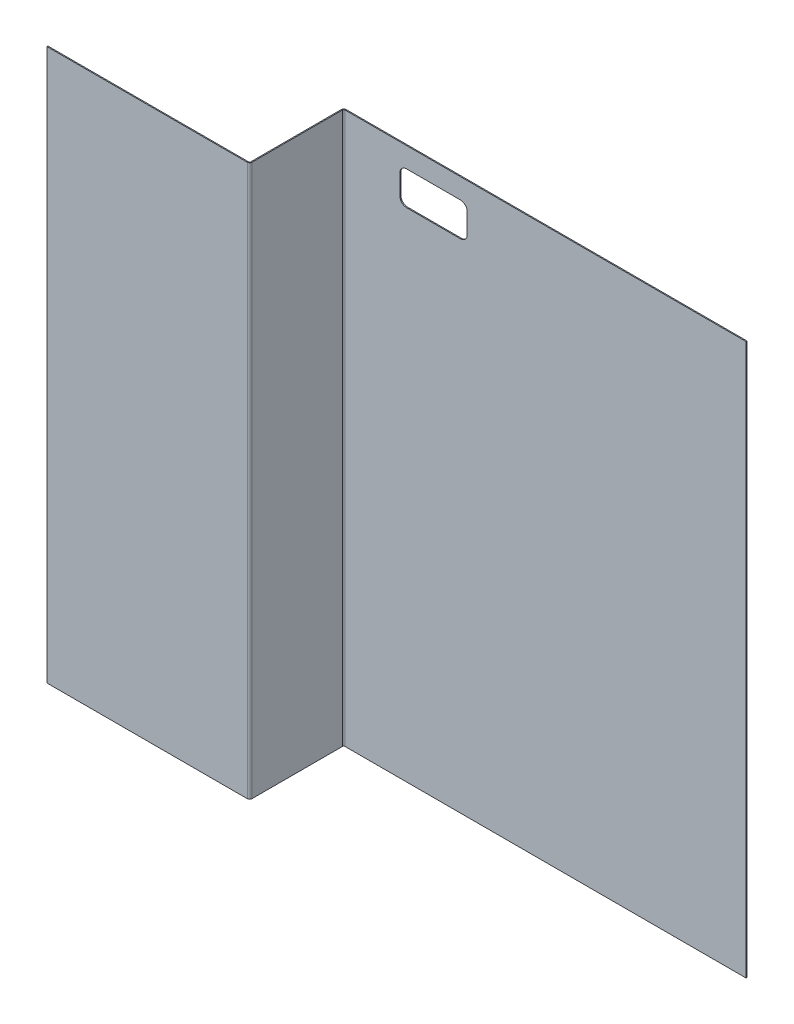
ISO-10303-21;
HEADER;
FILE_DESCRIPTION(('STEP AP214'),'2;1');
FILE_NAME('part.step','',(''),(''),'','','');
FILE_SCHEMA(('AUTOMOTIVE_DESIGN { 1 0 10303 214 1 1 1 1 }'));
ENDSEC;
DATA;
#1=APPLICATION_CONTEXT('core data for automotive mechanical design processes');
#2=APPLICATION_PROTOCOL_DEFINITION('international standard','automotive_design',2000,#1);
#3=PRODUCT_CONTEXT('',#1,'mechanical');
#4=PRODUCT('Part','Part','',(#3));
#5=PRODUCT_RELATED_PRODUCT_CATEGORY('part','',(#4));
#6=PRODUCT_DEFINITION_FORMATION('','',#4);
#7=PRODUCT_DEFINITION_CONTEXT('part definition',#1,'design');
#8=PRODUCT_DEFINITION('design','',#6,#7);
#9=PRODUCT_DEFINITION_SHAPE('','',#8);
#10=(LENGTH_UNIT() NAMED_UNIT(*) SI_UNIT(.MILLI.,.METRE.));
#11=(NAMED_UNIT(*) PLANE_ANGLE_UNIT() SI_UNIT($,.RADIAN.));
#12=(NAMED_UNIT(*) SI_UNIT($,.STERADIAN.) SOLID_ANGLE_UNIT());
#13=UNCERTAINTY_MEASURE_WITH_UNIT(LENGTH_MEASURE(1.E-05),#10,'distance_accuracy_value','');
#14=(GEOMETRIC_REPRESENTATION_CONTEXT(3) GLOBAL_UNCERTAINTY_ASSIGNED_CONTEXT((#13)) GLOBAL_UNIT_ASSIGNED_CONTEXT((#10,
#11,#12)) REPRESENTATION_CONTEXT('',''));
#15=CARTESIAN_POINT('',(0.,0.,0.));
#16=DIRECTION('',(0.,0.,1.));
#17=DIRECTION('',(1.,0.,0.));
#18=AXIS2_PLACEMENT_3D('',#15,#16,#17);
#19=CARTESIAN_POINT('',(301.500000000001,820.,-138.));
#20=DIRECTION('',(0.,1.,0.));
#21=DIRECTION('',(0.,0.,1.));
#22=AXIS2_PLACEMENT_3D('',#19,#20,#21);
#23=PLANE('',#22);
#24=DIRECTION('',(0.,0.,-1.));
#25=VECTOR('',#24,1.);
#26=CARTESIAN_POINT('',(301.500000000001,820.,-138.));
#27=LINE('',#26,#25);
#28=CARTESIAN_POINT('',(301.5,820.,-1.5));
#29=VERTEX_POINT('',#28);
#30=CARTESIAN_POINT('',(301.500000000001,820.,-136.));
#31=VERTEX_POINT('',#30);
#32=EDGE_CURVE('E312',#29,#31,#27,.T.);
#33=ORIENTED_EDGE('',*,*,#32,.T.);
#34=DIRECTION('',(-1.,0.,0.));
#35=VECTOR('',#34,1.);
#36=CARTESIAN_POINT('',(301.500000000001,820.,-136.));
#37=LINE('',#36,#35);
#38=CARTESIAN_POINT('',(300.000000000001,820.,-136.));
#39=VERTEX_POINT('',#38);
#40=EDGE_CURVE('E284',#31,#39,#37,.T.);
#41=ORIENTED_EDGE('',*,*,#40,.T.);
#42=DIRECTION('',(0.,0.,-1.));
#43=VECTOR('',#42,1.);
#44=CARTESIAN_POINT('',(300.000000000001,820.,-138.));
#45=LINE('',#44,#43);
#46=CARTESIAN_POINT('',(300.,820.,-1.50000000000001));
#47=VERTEX_POINT('',#46);
#48=EDGE_CURVE('E311',#47,#39,#45,.T.);
#49=ORIENTED_EDGE('',*,*,#48,.F.);
#50=DIRECTION('',(1.,0.,0.));
#51=VECTOR('',#50,1.);
#52=CARTESIAN_POINT('',(300.,820.,-1.5));
#53=LINE('',#52,#51);
#54=EDGE_CURVE('E298',#47,#29,#53,.T.);
#55=ORIENTED_EDGE('',*,*,#54,.T.);
#56=EDGE_LOOP('',(#33,#41,#49,#55));
#57=FACE_BOUND('',#56,.T.);
#58=ADVANCED_FACE('F40',(#57),#23,.T.);
#59=CARTESIAN_POINT('',(301.5,0.,1.08740406911582E-12));
#60=DIRECTION('',(1.,0.,0.));
#61=DIRECTION('',(0.,0.,-1.));
#62=AXIS2_PLACEMENT_3D('',#59,#60,#61);
#63=PLANE('',#62);
#64=DIRECTION('',(0.,0.,1.));
#65=VECTOR('',#64,1.);
#66=CARTESIAN_POINT('',(301.5,0.,0.500000000000005));
#67=LINE('',#66,#65);
#68=CARTESIAN_POINT('',(301.500000000001,2.18838184637305E-13,-136.));
#69=VERTEX_POINT('',#68);
#70=CARTESIAN_POINT('',(301.5,0.,-1.50000000000002));
#71=VERTEX_POINT('',#70);
#72=EDGE_CURVE('E315',#69,#71,#67,.T.);
#73=ORIENTED_EDGE('',*,*,#72,.F.);
#74=DIRECTION('',(0.,1.,0.));
#75=VECTOR('',#74,1.);
#76=CARTESIAN_POINT('',(301.500000000001,820.,-136.));
#77=LINE('',#76,#75);
#78=EDGE_CURVE('E290',#31,#69,#77,.F.);
#79=ORIENTED_EDGE('',*,*,#78,.F.);
#80=ORIENTED_EDGE('',*,*,#32,.F.);
#81=DIRECTION('',(0.,-1.,0.));
#82=VECTOR('',#81,1.);
#83=CARTESIAN_POINT('',(301.5,0.,-1.50000000000005));
#84=LINE('',#83,#82);
#85=EDGE_CURVE('E306',#29,#71,#84,.T.);
#86=ORIENTED_EDGE('',*,*,#85,.T.);
#87=EDGE_LOOP('',(#73,#79,#80,#86));
#88=FACE_BOUND('',#87,.T.);
#89=ADVANCED_FACE('F414',(#88),#63,.T.);
#90=CARTESIAN_POINT('',(300.,0.,1.08216684710755E-12));
#91=DIRECTION('',(1.,0.,0.));
#92=DIRECTION('',(0.,0.,-1.));
#93=AXIS2_PLACEMENT_3D('',#90,#91,#92);
#94=PLANE('',#93);
#95=DIRECTION('',(0.,1.,0.));
#96=VECTOR('',#95,1.);
#97=CARTESIAN_POINT('',(300.000000000001,820.,-136.));
#98=LINE('',#97,#96);
#99=CARTESIAN_POINT('',(300.000000000001,2.18838184637305E-13,-136.));
#100=VERTEX_POINT('',#99);
#101=EDGE_CURVE('E278',#39,#100,#98,.F.);
#102=ORIENTED_EDGE('',*,*,#101,.T.);
#103=DIRECTION('',(0.,0.,1.));
#104=VECTOR('',#103,1.);
#105=CARTESIAN_POINT('',(300.,0.,0.5));
#106=LINE('',#105,#104);
#107=CARTESIAN_POINT('',(300.,1.11022302462516E-13,-1.50000000000005));
#108=VERTEX_POINT('',#107);
#109=EDGE_CURVE('E316',#100,#108,#106,.T.);
#110=ORIENTED_EDGE('',*,*,#109,.T.);
#111=DIRECTION('',(0.,-1.,0.));
#112=VECTOR('',#111,1.);
#113=CARTESIAN_POINT('',(300.,820.,-1.5));
#114=LINE('',#113,#112);
#115=EDGE_CURVE('E300',#47,#108,#114,.T.);
#116=ORIENTED_EDGE('',*,*,#115,.F.);
#117=ORIENTED_EDGE('',*,*,#48,.T.);
#118=EDGE_LOOP('',(#102,#110,#116,#117));
#119=FACE_BOUND('',#118,.T.);
#120=ADVANCED_FACE('F376',(#119),#94,.F.);
#121=CARTESIAN_POINT('',(0.,0.,2.));
#122=DIRECTION('',(0.,1.,0.));
#123=DIRECTION('',(1.,0.,0.));
#124=AXIS2_PLACEMENT_3D('',#121,#122,#123);
#125=PLANE('',#124);
#126=DIRECTION('',(-1.,0.,0.));
#127=VECTOR('',#126,1.);
#128=CARTESIAN_POINT('',(0.,0.,0.5));
#129=LINE('',#128,#127);
#130=CARTESIAN_POINT('',(0.,0.,0.5));
#131=VERTEX_POINT('',#130);
#132=CARTESIAN_POINT('',(298.,0.,0.5));
#133=VERTEX_POINT('',#132);
#134=EDGE_CURVE('E355',#131,#133,#129,.F.);
#135=ORIENTED_EDGE('',*,*,#134,.T.);
#136=DIRECTION('',(0.,0.,1.));
#137=VECTOR('',#136,1.);
#138=CARTESIAN_POINT('',(298.,1.10913882245267E-13,0.499999999999943));
#139=LINE('',#138,#137);
#140=CARTESIAN_POINT('',(298.,1.10832567082331E-13,1.99999999999994));
#141=VERTEX_POINT('',#140);
#142=EDGE_CURVE('E328',#133,#141,#139,.T.);
#143=ORIENTED_EDGE('',*,*,#142,.T.);
#144=DIRECTION('',(1.,0.,0.));
#145=VECTOR('',#144,1.);
#146=CARTESIAN_POINT('',(0.,0.,2.));
#147=LINE('',#146,#145);
#148=CARTESIAN_POINT('',(0.,0.,2.));
#149=VERTEX_POINT('',#148);
#150=EDGE_CURVE('E348',#149,#141,#147,.T.);
#151=ORIENTED_EDGE('',*,*,#150,.F.);
#152=DIRECTION('',(0.,0.,1.));
#153=VECTOR('',#152,1.);
#154=CARTESIAN_POINT('',(0.,0.,2.));
#155=LINE('',#154,#153);
#156=EDGE_CURVE('E44',#131,#149,#155,.T.);
#157=ORIENTED_EDGE('',*,*,#156,.F.);
#158=EDGE_LOOP('',(#135,#143,#151,#157));
#159=FACE_BOUND('',#158,.T.);
#160=ADVANCED_FACE('F42',(#159),#125,.F.);
#161=CARTESIAN_POINT('',(0.,0.,2.));
#162=DIRECTION('',(0.,0.,-1.));
#163=DIRECTION('',(-1.,0.,0.));
#164=AXIS2_PLACEMENT_3D('',#161,#162,#163);
#165=PLANE('',#164);
#166=DIRECTION('',(0.,-1.,0.));
#167=VECTOR('',#166,1.);
#168=CARTESIAN_POINT('',(298.,0.,1.99999999999994));
#169=LINE('',#168,#167);
#170=CARTESIAN_POINT('',(298.,820.,2.));
#171=VERTEX_POINT('',#170);
#172=EDGE_CURVE('E322',#141,#171,#169,.F.);
#173=ORIENTED_EDGE('',*,*,#172,.T.);
#174=DIRECTION('',(-1.,0.,0.));
#175=VECTOR('',#174,1.);
#176=CARTESIAN_POINT('',(0.,820.,2.));
#177=LINE('',#176,#175);
#178=CARTESIAN_POINT('',(0.,820.,2.));
#179=VERTEX_POINT('',#178);
#180=EDGE_CURVE('E351',#171,#179,#177,.T.);
#181=ORIENTED_EDGE('',*,*,#180,.T.);
#182=DIRECTION('',(0.,-1.,0.));
#183=VECTOR('',#182,1.);
#184=CARTESIAN_POINT('',(0.,0.,2.));
#185=LINE('',#184,#183);
#186=EDGE_CURVE('E345',#179,#149,#185,.T.);
#187=ORIENTED_EDGE('',*,*,#186,.T.);
#188=ORIENTED_EDGE('',*,*,#150,.T.);
#189=EDGE_LOOP('',(#173,#181,#187,#188));
#190=FACE_BOUND('',#189,.T.);
#191=ADVANCED_FACE('F430',(#190),#165,.F.);
#192=CARTESIAN_POINT('',(0.,0.,0.5));
#193=DIRECTION('',(0.,0.,-1.));
#194=DIRECTION('',(-1.,0.,0.));
#195=AXIS2_PLACEMENT_3D('',#192,#193,#194);
#196=PLANE('',#195);
#197=DIRECTION('',(-1.,0.,0.));
#198=VECTOR('',#197,1.);
#199=CARTESIAN_POINT('',(0.,820.,0.5));
#200=LINE('',#199,#198);
#201=CARTESIAN_POINT('',(298.,820.,0.499999999999988));
#202=VERTEX_POINT('',#201);
#203=CARTESIAN_POINT('',(0.,820.,0.5));
#204=VERTEX_POINT('',#203);
#205=EDGE_CURVE('E349',#202,#204,#200,.T.);
#206=ORIENTED_EDGE('',*,*,#205,.F.);
#207=DIRECTION('',(0.,-1.,0.));
#208=VECTOR('',#207,1.);
#209=CARTESIAN_POINT('',(298.,0.,0.499999999999943));
#210=LINE('',#209,#208);
#211=EDGE_CURVE('E334',#133,#202,#210,.F.);
#212=ORIENTED_EDGE('',*,*,#211,.F.);
#213=ORIENTED_EDGE('',*,*,#134,.F.);
#214=DIRECTION('',(0.,1.,0.));
#215=VECTOR('',#214,1.);
#216=CARTESIAN_POINT('',(0.,0.,0.5));
#217=LINE('',#216,#215);
#218=EDGE_CURVE('E342',#204,#131,#217,.F.);
#219=ORIENTED_EDGE('',*,*,#218,.F.);
#220=EDGE_LOOP('',(#206,#212,#213,#219));
#221=FACE_BOUND('',#220,.T.);
#222=ADVANCED_FACE('F425',(#221),#196,.T.);
#223=CARTESIAN_POINT('',(0.,820.,2.));
#224=DIRECTION('',(0.,-1.,0.));
#225=DIRECTION('',(-1.,0.,0.));
#226=AXIS2_PLACEMENT_3D('',#223,#224,#225);
#227=PLANE('',#226);
#228=DIRECTION('',(0.,0.,1.));
#229=VECTOR('',#228,1.);
#230=CARTESIAN_POINT('',(298.,820.,0.499999999999988));
#231=LINE('',#230,#229);
#232=EDGE_CURVE('E339',#202,#171,#231,.T.);
#233=ORIENTED_EDGE('',*,*,#232,.F.);
#234=ORIENTED_EDGE('',*,*,#205,.T.);
#235=DIRECTION('',(0.,0.,1.));
#236=VECTOR('',#235,1.);
#237=CARTESIAN_POINT('',(0.,820.,2.));
#238=LINE('',#237,#236);
#239=EDGE_CURVE('E11',#204,#179,#238,.T.);
#240=ORIENTED_EDGE('',*,*,#239,.T.);
#241=ORIENTED_EDGE('',*,*,#180,.F.);
#242=EDGE_LOOP('',(#233,#234,#240,#241));
#243=FACE_BOUND('',#242,.T.);
#244=ADVANCED_FACE('F423',(#243),#227,.F.);
#245=CARTESIAN_POINT('',(0.,0.,2.));
#246=DIRECTION('',(1.,0.,0.));
#247=DIRECTION('',(0.,-1.,0.));
#248=AXIS2_PLACEMENT_3D('',#245,#246,#247);
#249=PLANE('',#248);
#250=ORIENTED_EDGE('',*,*,#239,.F.);
#251=ORIENTED_EDGE('',*,*,#218,.T.);
#252=ORIENTED_EDGE('',*,*,#156,.T.);
#253=ORIENTED_EDGE('',*,*,#186,.F.);
#254=EDGE_LOOP('',(#250,#251,#252,#253));
#255=FACE_BOUND('',#254,.T.);
#256=ADVANCED_FACE('F427',(#255),#249,.F.);
#257=CARTESIAN_POINT('',(298.,820.,-1.50000000000001));
#258=DIRECTION('',(0.,1.,0.));
#259=DIRECTION('',(0.,0.,1.));
#260=AXIS2_PLACEMENT_3D('',#257,#258,#259);
#261=PLANE('',#260);
#262=ORIENTED_EDGE('',*,*,#54,.F.);
#263=CARTESIAN_POINT('',(298.,820.,-1.50000000000001));
#264=DIRECTION('',(0.,-1.,0.));
#265=DIRECTION('',(0.,0.,-1.));
#266=AXIS2_PLACEMENT_3D('',#263,#264,#265);
#267=CIRCLE('',#266,2.);
#268=EDGE_CURVE('E331',#202,#47,#267,.F.);
#269=ORIENTED_EDGE('',*,*,#268,.F.);
#270=ORIENTED_EDGE('',*,*,#232,.T.);
#271=CARTESIAN_POINT('',(298.,820.,-1.50000000000001));
#272=DIRECTION('',(0.,-1.,0.));
#273=DIRECTION('',(0.,0.,-1.));
#274=AXIS2_PLACEMENT_3D('',#271,#272,#273);
#275=CIRCLE('',#274,3.5);
#276=EDGE_CURVE('E324',#171,#29,#275,.F.);
#277=ORIENTED_EDGE('',*,*,#276,.T.);
#278=EDGE_LOOP('',(#262,#269,#270,#277));
#279=FACE_BOUND('',#278,.T.);
#280=ADVANCED_FACE('F419',(#279),#261,.T.);
#281=CARTESIAN_POINT('',(298.,1.11022302462516E-13,-1.50000000000006));
#282=DIRECTION('',(0.,1.,0.));
#283=DIRECTION('',(0.,0.,1.));
#284=AXIS2_PLACEMENT_3D('',#281,#282,#283);
#285=PLANE('',#284);
#286=CARTESIAN_POINT('',(298.,1.11022302462516E-13,-1.50000000000006));
#287=DIRECTION('',(0.,-1.,0.));
#288=DIRECTION('',(0.,0.,-1.));
#289=AXIS2_PLACEMENT_3D('',#286,#287,#288);
#290=CIRCLE('',#289,2.);
#291=EDGE_CURVE('E318',#108,#133,#290,.T.);
#292=ORIENTED_EDGE('',*,*,#291,.F.);
#293=DIRECTION('',(1.,0.,0.));
#294=VECTOR('',#293,1.);
#295=CARTESIAN_POINT('',(300.,1.11022302462516E-13,-1.50000000000006));
#296=LINE('',#295,#294);
#297=EDGE_CURVE('E303',#108,#71,#296,.T.);
#298=ORIENTED_EDGE('',*,*,#297,.T.);
#299=CARTESIAN_POINT('',(298.,1.11022302462516E-13,-1.50000000000006));
#300=DIRECTION('',(0.,-1.,0.));
#301=DIRECTION('',(0.,0.,-1.));
#302=AXIS2_PLACEMENT_3D('',#299,#300,#301);
#303=CIRCLE('',#302,3.5);
#304=EDGE_CURVE('E325',#71,#141,#303,.T.);
#305=ORIENTED_EDGE('',*,*,#304,.T.);
#306=ORIENTED_EDGE('',*,*,#142,.F.);
#307=EDGE_LOOP('',(#292,#298,#305,#306));
#308=FACE_BOUND('',#307,.T.);
#309=ADVANCED_FACE('F367',(#308),#285,.F.);
#310=CARTESIAN_POINT('',(298.,0.,-1.50000000000006));
#311=DIRECTION('',(0.,-1.,0.));
#312=DIRECTION('',(1.,0.,0.));
#313=AXIS2_PLACEMENT_3D('',#310,#311,#312);
#314=CYLINDRICAL_SURFACE('',#313,3.5);
#315=ORIENTED_EDGE('',*,*,#172,.F.);
#316=ORIENTED_EDGE('',*,*,#304,.F.);
#317=ORIENTED_EDGE('',*,*,#85,.F.);
#318=ORIENTED_EDGE('',*,*,#276,.F.);
#319=EDGE_LOOP('',(#315,#316,#317,#318));
#320=FACE_BOUND('',#319,.T.);
#321=ADVANCED_FACE('F417',(#320),#314,.T.);
#322=CARTESIAN_POINT('',(298.,0.,-1.50000000000006));
#323=DIRECTION('',(0.,-1.,0.));
#324=DIRECTION('',(1.,0.,0.));
#325=AXIS2_PLACEMENT_3D('',#322,#323,#324);
#326=CYLINDRICAL_SURFACE('',#325,2.);
#327=ORIENTED_EDGE('',*,*,#211,.T.);
#328=ORIENTED_EDGE('',*,*,#268,.T.);
#329=ORIENTED_EDGE('',*,*,#115,.T.);
#330=ORIENTED_EDGE('',*,*,#291,.T.);
#331=EDGE_LOOP('',(#327,#328,#329,#330));
#332=FACE_BOUND('',#331,.T.);
#333=ADVANCED_FACE('F371',(#332),#326,.F.);
#334=CARTESIAN_POINT('',(301.5,0.,0.500000000000005));
#335=DIRECTION('',(0.,-1.,0.));
#336=DIRECTION('',(0.,0.,-1.));
#337=AXIS2_PLACEMENT_3D('',#334,#335,#336);
#338=PLANE('',#337);
#339=DIRECTION('',(-1.,0.,0.));
#340=VECTOR('',#339,1.);
#341=CARTESIAN_POINT('',(301.500000000001,2.22044604925031E-13,-136.));
#342=LINE('',#341,#340);
#343=EDGE_CURVE('E295',#69,#100,#342,.T.);
#344=ORIENTED_EDGE('',*,*,#343,.F.);
#345=ORIENTED_EDGE('',*,*,#72,.T.);
#346=ORIENTED_EDGE('',*,*,#297,.F.);
#347=ORIENTED_EDGE('',*,*,#109,.F.);
#348=EDGE_LOOP('',(#344,#345,#346,#347));
#349=FACE_BOUND('',#348,.T.);
#350=ADVANCED_FACE('F412',(#349),#338,.T.);
#351=CARTESIAN_POINT('',(303.500000000001,2.22044604925031E-13,-136.));
#352=DIRECTION('',(0.,-1.,0.));
#353=DIRECTION('',(0.,0.,-1.));
#354=AXIS2_PLACEMENT_3D('',#351,#352,#353);
#355=PLANE('',#354);
#356=DIRECTION('',(0.,0.,-1.));
#357=VECTOR('',#356,1.);
#358=CARTESIAN_POINT('',(303.500000000001,2.22044604925031E-13,-138.));
#359=LINE('',#358,#357);
#360=CARTESIAN_POINT('',(303.500000000001,2.22044604925031E-13,-138.));
#361=VERTEX_POINT('',#360);
#362=CARTESIAN_POINT('',(303.500000000001,2.22044604925031E-13,-139.5));
#363=VERTEX_POINT('',#362);
#364=EDGE_CURVE('E234',#361,#363,#359,.T.);
#365=ORIENTED_EDGE('',*,*,#364,.F.);
#366=CARTESIAN_POINT('',(303.500000000001,2.22044604925031E-13,-136.));
#367=DIRECTION('',(0.,1.,0.));
#368=DIRECTION('',(0.,0.,1.));
#369=AXIS2_PLACEMENT_3D('',#366,#367,#368);
#370=CIRCLE('',#369,2.);
#371=EDGE_CURVE('E287',#69,#361,#370,.F.);
#372=ORIENTED_EDGE('',*,*,#371,.F.);
#373=ORIENTED_EDGE('',*,*,#343,.T.);
#374=CARTESIAN_POINT('',(303.500000000001,2.22044604925031E-13,-136.));
#375=DIRECTION('',(0.,1.,0.));
#376=DIRECTION('',(0.,0.,1.));
#377=AXIS2_PLACEMENT_3D('',#374,#375,#376);
#378=CIRCLE('',#377,3.5);
#379=EDGE_CURVE('E280',#100,#363,#378,.F.);
#380=ORIENTED_EDGE('',*,*,#379,.T.);
#381=EDGE_LOOP('',(#365,#372,#373,#380));
#382=FACE_BOUND('',#381,.T.);
#383=ADVANCED_FACE('F409',(#382),#355,.T.);
#384=CARTESIAN_POINT('',(303.500000000001,820.,-136.));
#385=DIRECTION('',(0.,-1.,0.));
#386=DIRECTION('',(0.,0.,-1.));
#387=AXIS2_PLACEMENT_3D('',#384,#385,#386);
#388=PLANE('',#387);
#389=CARTESIAN_POINT('',(303.500000000001,820.,-136.));
#390=DIRECTION('',(0.,1.,0.));
#391=DIRECTION('',(0.,0.,1.));
#392=AXIS2_PLACEMENT_3D('',#389,#390,#391);
#393=CIRCLE('',#392,2.);
#394=CARTESIAN_POINT('',(303.500000000001,820.,-138.));
#395=VERTEX_POINT('',#394);
#396=EDGE_CURVE('E275',#395,#31,#393,.T.);
#397=ORIENTED_EDGE('',*,*,#396,.F.);
#398=DIRECTION('',(0.,0.,-1.));
#399=VECTOR('',#398,1.);
#400=CARTESIAN_POINT('',(303.500000000001,820.,-138.));
#401=LINE('',#400,#399);
#402=CARTESIAN_POINT('',(303.500000000001,820.,-139.5));
#403=VERTEX_POINT('',#402);
#404=EDGE_CURVE('E248',#395,#403,#401,.T.);
#405=ORIENTED_EDGE('',*,*,#404,.T.);
#406=CARTESIAN_POINT('',(303.500000000001,820.,-136.));
#407=DIRECTION('',(0.,1.,0.));
#408=DIRECTION('',(0.,0.,1.));
#409=AXIS2_PLACEMENT_3D('',#406,#407,#408);
#410=CIRCLE('',#409,3.5);
#411=EDGE_CURVE('E281',#403,#39,#410,.T.);
#412=ORIENTED_EDGE('',*,*,#411,.T.);
#413=ORIENTED_EDGE('',*,*,#40,.F.);
#414=EDGE_LOOP('',(#397,#405,#412,#413));
#415=FACE_BOUND('',#414,.T.);
#416=ADVANCED_FACE('F384',(#415),#388,.F.);
#417=CARTESIAN_POINT('',(303.500000000001,820.,-136.));
#418=DIRECTION('',(0.,1.,0.));
#419=DIRECTION('',(0.,0.,-1.));
#420=AXIS2_PLACEMENT_3D('',#417,#418,#419);
#421=CYLINDRICAL_SURFACE('',#420,3.5);
#422=ORIENTED_EDGE('',*,*,#101,.F.);
#423=ORIENTED_EDGE('',*,*,#411,.F.);
#424=DIRECTION('',(0.,1.,0.));
#425=VECTOR('',#424,1.);
#426=CARTESIAN_POINT('',(303.500000000001,0.,-139.5));
#427=LINE('',#426,#425);
#428=EDGE_CURVE('E251',#363,#403,#427,.T.);
#429=ORIENTED_EDGE('',*,*,#428,.F.);
#430=ORIENTED_EDGE('',*,*,#379,.F.);
#431=EDGE_LOOP('',(#422,#423,#429,#430));
#432=FACE_BOUND('',#431,.T.);
#433=ADVANCED_FACE('F407',(#432),#421,.T.);
#434=CARTESIAN_POINT('',(303.500000000001,820.,-136.));
#435=DIRECTION('',(0.,1.,0.));
#436=DIRECTION('',(0.,0.,-1.));
#437=AXIS2_PLACEMENT_3D('',#434,#435,#436);
#438=CYLINDRICAL_SURFACE('',#437,2.);
#439=ORIENTED_EDGE('',*,*,#78,.T.);
#440=ORIENTED_EDGE('',*,*,#371,.T.);
#441=DIRECTION('',(0.,1.,0.));
#442=VECTOR('',#441,1.);
#443=CARTESIAN_POINT('',(303.500000000001,2.22044604925031E-13,-138.));
#444=LINE('',#443,#442);
#445=EDGE_CURVE('E246',#361,#395,#444,.T.);
#446=ORIENTED_EDGE('',*,*,#445,.T.);
#447=ORIENTED_EDGE('',*,*,#396,.T.);
#448=EDGE_LOOP('',(#439,#440,#446,#447));
#449=FACE_BOUND('',#448,.T.);
#450=ADVANCED_FACE('F386',(#449),#438,.F.);
#451=CARTESIAN_POINT('',(301.500000000001,820.,-139.5));
#452=DIRECTION('',(0.,1.,0.));
#453=DIRECTION('',(0.,0.,1.));
#454=AXIS2_PLACEMENT_3D('',#451,#452,#453);
#455=PLANE('',#454);
#456=DIRECTION('',(-1.,0.,0.));
#457=VECTOR('',#456,1.);
#458=CARTESIAN_POINT('',(301.500000000001,820.,-139.5));
#459=LINE('',#458,#457);
#460=CARTESIAN_POINT('',(900.000000000001,820.,-139.5));
#461=VERTEX_POINT('',#460);
#462=EDGE_CURVE('E263',#461,#403,#459,.T.);
#463=ORIENTED_EDGE('',*,*,#462,.T.);
#464=ORIENTED_EDGE('',*,*,#404,.F.);
#465=DIRECTION('',(-1.,0.,0.));
#466=VECTOR('',#465,1.);
#467=CARTESIAN_POINT('',(301.500000000001,820.,-138.));
#468=LINE('',#467,#466);
#469=CARTESIAN_POINT('',(900.000000000001,820.,-138.));
#470=VERTEX_POINT('',#469);
#471=EDGE_CURVE('E260',#470,#395,#468,.T.);
#472=ORIENTED_EDGE('',*,*,#471,.F.);
#473=DIRECTION('',(0.,0.,1.));
#474=VECTOR('',#473,1.);
#475=CARTESIAN_POINT('',(900.000000000001,820.,-139.5));
#476=LINE('',#475,#474);
#477=EDGE_CURVE('E273',#461,#470,#476,.T.);
#478=ORIENTED_EDGE('',*,*,#477,.F.);
#479=EDGE_LOOP('',(#463,#464,#472,#478));
#480=FACE_BOUND('',#479,.T.);
#481=ADVANCED_FACE('F403',(#480),#455,.T.);
#482=CARTESIAN_POINT('',(900.000000000001,2.22044604925031E-13,-139.5));
#483=DIRECTION('',(0.,-1.,0.));
#484=DIRECTION('',(0.,0.,-1.));
#485=AXIS2_PLACEMENT_3D('',#482,#483,#484);
#486=PLANE('',#485);
#487=DIRECTION('',(1.,0.,0.));
#488=VECTOR('',#487,1.);
#489=CARTESIAN_POINT('',(900.000000000001,2.22044604925031E-13,-138.));
#490=LINE('',#489,#488);
#491=CARTESIAN_POINT('',(900.000000000001,2.22044604925031E-13,-138.));
#492=VERTEX_POINT('',#491);
#493=EDGE_CURVE('E256',#361,#492,#490,.T.);
#494=ORIENTED_EDGE('',*,*,#493,.F.);
#495=ORIENTED_EDGE('',*,*,#364,.T.);
#496=DIRECTION('',(1.,0.,0.));
#497=VECTOR('',#496,1.);
#498=CARTESIAN_POINT('',(900.000000000001,2.22044604925031E-13,-139.5));
#499=LINE('',#498,#497);
#500=CARTESIAN_POINT('',(900.000000000001,2.22044604925031E-13,-139.5));
#501=VERTEX_POINT('',#500);
#502=EDGE_CURVE('E257',#363,#501,#499,.T.);
#503=ORIENTED_EDGE('',*,*,#502,.T.);
#504=DIRECTION('',(0.,0.,1.));
#505=VECTOR('',#504,1.);
#506=CARTESIAN_POINT('',(900.000000000001,2.22044604925031E-13,-139.5));
#507=LINE('',#506,#505);
#508=EDGE_CURVE('E266',#501,#492,#507,.T.);
#509=ORIENTED_EDGE('',*,*,#508,.T.);
#510=EDGE_LOOP('',(#494,#495,#503,#509));
#511=FACE_BOUND('',#510,.T.);
#512=ADVANCED_FACE('F395',(#511),#486,.T.);
#513=CARTESIAN_POINT('',(0.,0.,-139.5));
#514=DIRECTION('',(0.,0.,-1.));
#515=DIRECTION('',(-1.,0.,0.));
#516=AXIS2_PLACEMENT_3D('',#513,#514,#515);
#517=PLANE('',#516);
#518=CARTESIAN_POINT('',(395.11739874533,749.936561893923,-139.5));
#519=DIRECTION('',(0.,0.,1.));
#520=DIRECTION('',(1.,0.,0.));
#521=AXIS2_PLACEMENT_3D('',#518,#519,#520);
#522=CIRCLE('',#521,10.);
#523=CARTESIAN_POINT('',(385.11739874533,749.936561893923,-139.5));
#524=VERTEX_POINT('',#523);
#525=CARTESIAN_POINT('',(395.11739874533,739.936561893923,-139.5));
#526=VERTEX_POINT('',#525);
#527=EDGE_CURVE('E179',#524,#526,#522,.T.);
#528=ORIENTED_EDGE('',*,*,#527,.T.);
#529=DIRECTION('',(1.,0.,0.));
#530=VECTOR('',#529,1.);
#531=CARTESIAN_POINT('',(395.11739874533,739.936561893923,-139.5));
#532=LINE('',#531,#530);
#533=CARTESIAN_POINT('',(475.11739874533,739.936561893923,-139.5));
#534=VERTEX_POINT('',#533);
#535=EDGE_CURVE('E188',#526,#534,#532,.T.);
#536=ORIENTED_EDGE('',*,*,#535,.T.);
#537=CARTESIAN_POINT('',(475.11739874533,749.936561893923,-139.5));
#538=DIRECTION('',(0.,0.,1.));
#539=DIRECTION('',(1.,0.,0.));
#540=AXIS2_PLACEMENT_3D('',#537,#538,#539);
#541=CIRCLE('',#540,10.);
#542=CARTESIAN_POINT('',(485.11739874533,749.936561893923,-139.5));
#543=VERTEX_POINT('',#542);
#544=EDGE_CURVE('E55',#534,#543,#541,.T.);
#545=ORIENTED_EDGE('',*,*,#544,.T.);
#546=DIRECTION('',(0.,1.,0.));
#547=VECTOR('',#546,1.);
#548=CARTESIAN_POINT('',(485.11739874533,779.936561893923,-139.5));
#549=LINE('',#548,#547);
#550=CARTESIAN_POINT('',(485.11739874533,779.936561893923,-139.5));
#551=VERTEX_POINT('',#550);
#552=EDGE_CURVE('E203',#543,#551,#549,.T.);
#553=ORIENTED_EDGE('',*,*,#552,.T.);
#554=CARTESIAN_POINT('',(475.11739874533,779.936561893923,-139.5));
#555=DIRECTION('',(0.,0.,1.));
#556=DIRECTION('',(-1.,0.,0.));
#557=AXIS2_PLACEMENT_3D('',#554,#555,#556);
#558=CIRCLE('',#557,10.);
#559=CARTESIAN_POINT('',(475.11739874533,789.936561893923,-139.5));
#560=VERTEX_POINT('',#559);
#561=EDGE_CURVE('E206',#551,#560,#558,.T.);
#562=ORIENTED_EDGE('',*,*,#561,.T.);
#563=DIRECTION('',(-1.,0.,0.));
#564=VECTOR('',#563,1.);
#565=CARTESIAN_POINT('',(395.11739874533,789.936561893923,-139.5));
#566=LINE('',#565,#564);
#567=CARTESIAN_POINT('',(395.11739874533,789.936561893923,-139.5));
#568=VERTEX_POINT('',#567);
#569=EDGE_CURVE('E209',#560,#568,#566,.T.);
#570=ORIENTED_EDGE('',*,*,#569,.T.);
#571=CARTESIAN_POINT('',(395.11739874533,779.936561893923,-139.5));
#572=DIRECTION('',(0.,0.,1.));
#573=DIRECTION('',(1.,0.,0.));
#574=AXIS2_PLACEMENT_3D('',#571,#572,#573);
#575=CIRCLE('',#574,10.);
#576=CARTESIAN_POINT('',(385.11739874533,779.936561893923,-139.5));
#577=VERTEX_POINT('',#576);
#578=EDGE_CURVE('E212',#568,#577,#575,.T.);
#579=ORIENTED_EDGE('',*,*,#578,.T.);
#580=DIRECTION('',(0.,-1.,0.));
#581=VECTOR('',#580,1.);
#582=CARTESIAN_POINT('',(385.11739874533,779.936561893923,-139.5));
#583=LINE('',#582,#581);
#584=EDGE_CURVE('E185',#577,#524,#583,.T.);
#585=ORIENTED_EDGE('',*,*,#584,.T.);
#586=EDGE_LOOP('',(#528,#536,#545,#553,#562,#570,#579,#585));
#587=FACE_BOUND('',#586,.T.);
#588=ORIENTED_EDGE('',*,*,#502,.F.);
#589=ORIENTED_EDGE('',*,*,#428,.T.);
#590=ORIENTED_EDGE('',*,*,#462,.F.);
#591=DIRECTION('',(0.,1.,0.));
#592=VECTOR('',#591,1.);
#593=CARTESIAN_POINT('',(900.000000000001,820.,-139.5));
#594=LINE('',#593,#592);
#595=EDGE_CURVE('E259',#501,#461,#594,.T.);
#596=ORIENTED_EDGE('',*,*,#595,.F.);
#597=EDGE_LOOP('',(#588,#589,#590,#596));
#598=FACE_BOUND('',#597,.T.);
#599=ADVANCED_FACE('F192',(#587,#598),#517,.T.);
#600=CARTESIAN_POINT('',(0.,0.,-138.));
#601=DIRECTION('',(0.,0.,-1.));
#602=DIRECTION('',(-1.,0.,0.));
#603=AXIS2_PLACEMENT_3D('',#600,#601,#602);
#604=PLANE('',#603);
#605=DIRECTION('',(1.,0.,0.));
#606=VECTOR('',#605,1.);
#607=CARTESIAN_POINT('',(395.11739874533,739.936561893923,-138.));
#608=LINE('',#607,#606);
#609=CARTESIAN_POINT('',(395.11739874533,739.936561893923,-138.));
#610=VERTEX_POINT('',#609);
#611=CARTESIAN_POINT('',(475.11739874533,739.936561893923,-138.));
#612=VERTEX_POINT('',#611);
#613=EDGE_CURVE('E216',#610,#612,#608,.T.);
#614=ORIENTED_EDGE('',*,*,#613,.F.);
#615=CARTESIAN_POINT('',(395.11739874533,749.936561893923,-138.));
#616=DIRECTION('',(0.,0.,1.));
#617=DIRECTION('',(1.,0.,0.));
#618=AXIS2_PLACEMENT_3D('',#615,#616,#617);
#619=CIRCLE('',#618,10.);
#620=CARTESIAN_POINT('',(385.11739874533,749.936561893923,-138.));
#621=VERTEX_POINT('',#620);
#622=EDGE_CURVE('E63',#621,#610,#619,.T.);
#623=ORIENTED_EDGE('',*,*,#622,.F.);
#624=DIRECTION('',(0.,-1.,0.));
#625=VECTOR('',#624,1.);
#626=CARTESIAN_POINT('',(385.11739874533,779.936561893923,-138.));
#627=LINE('',#626,#625);
#628=CARTESIAN_POINT('',(385.11739874533,779.936561893923,-138.));
#629=VERTEX_POINT('',#628);
#630=EDGE_CURVE('E196',#629,#621,#627,.T.);
#631=ORIENTED_EDGE('',*,*,#630,.F.);
#632=CARTESIAN_POINT('',(395.11739874533,779.936561893923,-138.));
#633=DIRECTION('',(0.,0.,1.));
#634=DIRECTION('',(1.,0.,0.));
#635=AXIS2_PLACEMENT_3D('',#632,#633,#634);
#636=CIRCLE('',#635,10.);
#637=CARTESIAN_POINT('',(395.11739874533,789.936561893923,-138.));
#638=VERTEX_POINT('',#637);
#639=EDGE_CURVE('E199',#638,#629,#636,.T.);
#640=ORIENTED_EDGE('',*,*,#639,.F.);
#641=DIRECTION('',(-1.,0.,0.));
#642=VECTOR('',#641,1.);
#643=CARTESIAN_POINT('',(395.11739874533,789.936561893923,-138.));
#644=LINE('',#643,#642);
#645=CARTESIAN_POINT('',(475.11739874533,789.936561893923,-138.));
#646=VERTEX_POINT('',#645);
#647=EDGE_CURVE('E227',#646,#638,#644,.T.);
#648=ORIENTED_EDGE('',*,*,#647,.F.);
#649=CARTESIAN_POINT('',(475.11739874533,779.936561893923,-138.));
#650=DIRECTION('',(0.,0.,1.));
#651=DIRECTION('',(-1.,0.,0.));
#652=AXIS2_PLACEMENT_3D('',#649,#650,#651);
#653=CIRCLE('',#652,10.);
#654=CARTESIAN_POINT('',(485.11739874533,779.936561893923,-138.));
#655=VERTEX_POINT('',#654);
#656=EDGE_CURVE('E224',#655,#646,#653,.T.);
#657=ORIENTED_EDGE('',*,*,#656,.F.);
#658=DIRECTION('',(0.,1.,0.));
#659=VECTOR('',#658,1.);
#660=CARTESIAN_POINT('',(485.11739874533,779.936561893923,-138.));
#661=LINE('',#660,#659);
#662=CARTESIAN_POINT('',(485.11739874533,749.936561893923,-138.));
#663=VERTEX_POINT('',#662);
#664=EDGE_CURVE('E221',#663,#655,#661,.T.);
#665=ORIENTED_EDGE('',*,*,#664,.F.);
#666=CARTESIAN_POINT('',(475.11739874533,749.936561893923,-138.));
#667=DIRECTION('',(0.,0.,1.));
#668=DIRECTION('',(1.,0.,0.));
#669=AXIS2_PLACEMENT_3D('',#666,#667,#668);
#670=CIRCLE('',#669,10.);
#671=EDGE_CURVE('E218',#612,#663,#670,.T.);
#672=ORIENTED_EDGE('',*,*,#671,.F.);
#673=EDGE_LOOP('',(#614,#623,#631,#640,#648,#657,#665,#672));
#674=FACE_BOUND('',#673,.T.);
#675=ORIENTED_EDGE('',*,*,#445,.F.);
#676=ORIENTED_EDGE('',*,*,#493,.T.);
#677=DIRECTION('',(0.,1.,0.));
#678=VECTOR('',#677,1.);
#679=CARTESIAN_POINT('',(900.000000000001,820.,-138.));
#680=LINE('',#679,#678);
#681=EDGE_CURVE('E268',#492,#470,#680,.T.);
#682=ORIENTED_EDGE('',*,*,#681,.T.);
#683=ORIENTED_EDGE('',*,*,#471,.T.);
#684=EDGE_LOOP('',(#675,#676,#682,#683));
#685=FACE_BOUND('',#684,.T.);
#686=ADVANCED_FACE('F391',(#674,#685),#604,.F.);
#687=CARTESIAN_POINT('',(900.000000000001,820.,-139.5));
#688=DIRECTION('',(1.,0.,0.));
#689=DIRECTION('',(0.,0.,-1.));
#690=AXIS2_PLACEMENT_3D('',#687,#688,#689);
#691=PLANE('',#690);
#692=ORIENTED_EDGE('',*,*,#681,.F.);
#693=ORIENTED_EDGE('',*,*,#508,.F.);
#694=ORIENTED_EDGE('',*,*,#595,.T.);
#695=ORIENTED_EDGE('',*,*,#477,.T.);
#696=EDGE_LOOP('',(#692,#693,#694,#695));
#697=FACE_BOUND('',#696,.T.);
#698=ADVANCED_FACE('F401',(#697),#691,.T.);
#699=CARTESIAN_POINT('',(395.11739874533,749.936561893923,-139.5));
#700=DIRECTION('',(0.,0.,1.));
#701=DIRECTION('',(1.,0.,0.));
#702=AXIS2_PLACEMENT_3D('',#699,#700,#701);
#703=CYLINDRICAL_SURFACE('',#702,10.);
#704=ORIENTED_EDGE('',*,*,#622,.T.);
#705=DIRECTION('',(0.,0.,1.));
#706=VECTOR('',#705,1.);
#707=CARTESIAN_POINT('',(395.11739874533,739.936561893923,-139.5));
#708=LINE('',#707,#706);
#709=EDGE_CURVE('E175',#526,#610,#708,.T.);
#710=ORIENTED_EDGE('',*,*,#709,.F.);
#711=ORIENTED_EDGE('',*,*,#527,.F.);
#712=DIRECTION('',(0.,0.,1.));
#713=VECTOR('',#712,1.);
#714=CARTESIAN_POINT('',(385.11739874533,749.936561893923,-139.5));
#715=LINE('',#714,#713);
#716=EDGE_CURVE('E232',#524,#621,#715,.T.);
#717=ORIENTED_EDGE('',*,*,#716,.T.);
#718=EDGE_LOOP('',(#704,#710,#711,#717));
#719=FACE_BOUND('',#718,.T.);
#720=ADVANCED_FACE('F177',(#719),#703,.F.);
#721=CARTESIAN_POINT('',(385.11739874533,779.936561893923,-139.5));
#722=DIRECTION('',(-1.,0.,0.));
#723=DIRECTION('',(0.,0.,1.));
#724=AXIS2_PLACEMENT_3D('',#721,#722,#723);
#725=PLANE('',#724);
#726=ORIENTED_EDGE('',*,*,#630,.T.);
#727=ORIENTED_EDGE('',*,*,#716,.F.);
#728=ORIENTED_EDGE('',*,*,#584,.F.);
#729=DIRECTION('',(0.,0.,1.));
#730=VECTOR('',#729,1.);
#731=CARTESIAN_POINT('',(385.11739874533,779.936561893923,-139.5));
#732=LINE('',#731,#730);
#733=EDGE_CURVE('E235',#577,#629,#732,.T.);
#734=ORIENTED_EDGE('',*,*,#733,.T.);
#735=EDGE_LOOP('',(#726,#727,#728,#734));
#736=FACE_BOUND('',#735,.T.);
#737=ADVANCED_FACE('F540',(#736),#725,.F.);
#738=CARTESIAN_POINT('',(395.11739874533,779.936561893923,-139.5));
#739=DIRECTION('',(0.,0.,1.));
#740=DIRECTION('',(1.,0.,0.));
#741=AXIS2_PLACEMENT_3D('',#738,#739,#740);
#742=CYLINDRICAL_SURFACE('',#741,10.);
#743=ORIENTED_EDGE('',*,*,#639,.T.);
#744=ORIENTED_EDGE('',*,*,#733,.F.);
#745=ORIENTED_EDGE('',*,*,#578,.F.);
#746=DIRECTION('',(0.,0.,1.));
#747=VECTOR('',#746,1.);
#748=CARTESIAN_POINT('',(395.11739874533,789.936561893923,-139.5));
#749=LINE('',#748,#747);
#750=EDGE_CURVE('E237',#568,#638,#749,.T.);
#751=ORIENTED_EDGE('',*,*,#750,.T.);
#752=EDGE_LOOP('',(#743,#744,#745,#751));
#753=FACE_BOUND('',#752,.T.);
#754=ADVANCED_FACE('F547',(#753),#742,.F.);
#755=CARTESIAN_POINT('',(395.11739874533,789.936561893923,-139.5));
#756=DIRECTION('',(0.,1.,0.));
#757=DIRECTION('',(0.,0.,1.));
#758=AXIS2_PLACEMENT_3D('',#755,#756,#757);
#759=PLANE('',#758);
#760=ORIENTED_EDGE('',*,*,#647,.T.);
#761=ORIENTED_EDGE('',*,*,#750,.F.);
#762=ORIENTED_EDGE('',*,*,#569,.F.);
#763=DIRECTION('',(0.,0.,1.));
#764=VECTOR('',#763,1.);
#765=CARTESIAN_POINT('',(475.11739874533,789.936561893923,-139.5));
#766=LINE('',#765,#764);
#767=EDGE_CURVE('E239',#560,#646,#766,.T.);
#768=ORIENTED_EDGE('',*,*,#767,.T.);
#769=EDGE_LOOP('',(#760,#761,#762,#768));
#770=FACE_BOUND('',#769,.T.);
#771=ADVANCED_FACE('F555',(#770),#759,.F.);
#772=CARTESIAN_POINT('',(475.11739874533,779.936561893923,-139.5));
#773=DIRECTION('',(0.,0.,1.));
#774=DIRECTION('',(1.,0.,0.));
#775=AXIS2_PLACEMENT_3D('',#772,#773,#774);
#776=CYLINDRICAL_SURFACE('',#775,10.);
#777=ORIENTED_EDGE('',*,*,#656,.T.);
#778=ORIENTED_EDGE('',*,*,#767,.F.);
#779=ORIENTED_EDGE('',*,*,#561,.F.);
#780=DIRECTION('',(0.,0.,1.));
#781=VECTOR('',#780,1.);
#782=CARTESIAN_POINT('',(485.11739874533,779.936561893923,-139.5));
#783=LINE('',#782,#781);
#784=EDGE_CURVE('E241',#551,#655,#783,.T.);
#785=ORIENTED_EDGE('',*,*,#784,.T.);
#786=EDGE_LOOP('',(#777,#778,#779,#785));
#787=FACE_BOUND('',#786,.T.);
#788=ADVANCED_FACE('F563',(#787),#776,.F.);
#789=CARTESIAN_POINT('',(485.11739874533,779.936561893923,-139.5));
#790=DIRECTION('',(1.,0.,0.));
#791=DIRECTION('',(0.,0.,-1.));
#792=AXIS2_PLACEMENT_3D('',#789,#790,#791);
#793=PLANE('',#792);
#794=ORIENTED_EDGE('',*,*,#664,.T.);
#795=ORIENTED_EDGE('',*,*,#784,.F.);
#796=ORIENTED_EDGE('',*,*,#552,.F.);
#797=DIRECTION('',(0.,0.,1.));
#798=VECTOR('',#797,1.);
#799=CARTESIAN_POINT('',(485.11739874533,749.936561893923,-139.5));
#800=LINE('',#799,#798);
#801=EDGE_CURVE('E243',#543,#663,#800,.T.);
#802=ORIENTED_EDGE('',*,*,#801,.T.);
#803=EDGE_LOOP('',(#794,#795,#796,#802));
#804=FACE_BOUND('',#803,.T.);
#805=ADVANCED_FACE('F571',(#804),#793,.F.);
#806=CARTESIAN_POINT('',(475.11739874533,749.936561893923,-139.5));
#807=DIRECTION('',(0.,0.,1.));
#808=DIRECTION('',(1.,0.,0.));
#809=AXIS2_PLACEMENT_3D('',#806,#807,#808);
#810=CYLINDRICAL_SURFACE('',#809,10.);
#811=ORIENTED_EDGE('',*,*,#671,.T.);
#812=ORIENTED_EDGE('',*,*,#801,.F.);
#813=ORIENTED_EDGE('',*,*,#544,.F.);
#814=DIRECTION('',(0.,0.,1.));
#815=VECTOR('',#814,1.);
#816=CARTESIAN_POINT('',(475.11739874533,739.936561893923,-139.5));
#817=LINE('',#816,#815);
#818=EDGE_CURVE('E184',#534,#612,#817,.T.);
#819=ORIENTED_EDGE('',*,*,#818,.T.);
#820=EDGE_LOOP('',(#811,#812,#813,#819));
#821=FACE_BOUND('',#820,.T.);
#822=ADVANCED_FACE('F579',(#821),#810,.F.);
#823=CARTESIAN_POINT('',(395.11739874533,739.936561893923,-139.5));
#824=DIRECTION('',(0.,-1.,0.));
#825=DIRECTION('',(0.,0.,-1.));
#826=AXIS2_PLACEMENT_3D('',#823,#824,#825);
#827=PLANE('',#826);
#828=ORIENTED_EDGE('',*,*,#613,.T.);
#829=ORIENTED_EDGE('',*,*,#818,.F.);
#830=ORIENTED_EDGE('',*,*,#535,.F.);
#831=ORIENTED_EDGE('',*,*,#709,.T.);
#832=EDGE_LOOP('',(#828,#829,#830,#831));
#833=FACE_BOUND('',#832,.T.);
#834=ADVANCED_FACE('F189',(#833),#827,.F.);
#835=CLOSED_SHELL('',(#58,#89,#120,#160,#191,#222,#244,#256,#280,#309,#321,#333,#350,#383,#416,
#433,#450,#481,#512,#599,#686,#698,#720,#737,#754,#771,#788,#805,#822,#834));
#836=MANIFOLD_SOLID_BREP('B2',#835);
#837=ADVANCED_BREP_SHAPE_REPRESENTATION('',(#18,#836),#14);
#838=SHAPE_DEFINITION_REPRESENTATION(#9,#837);
ENDSEC;
END-ISO-10303-21;
